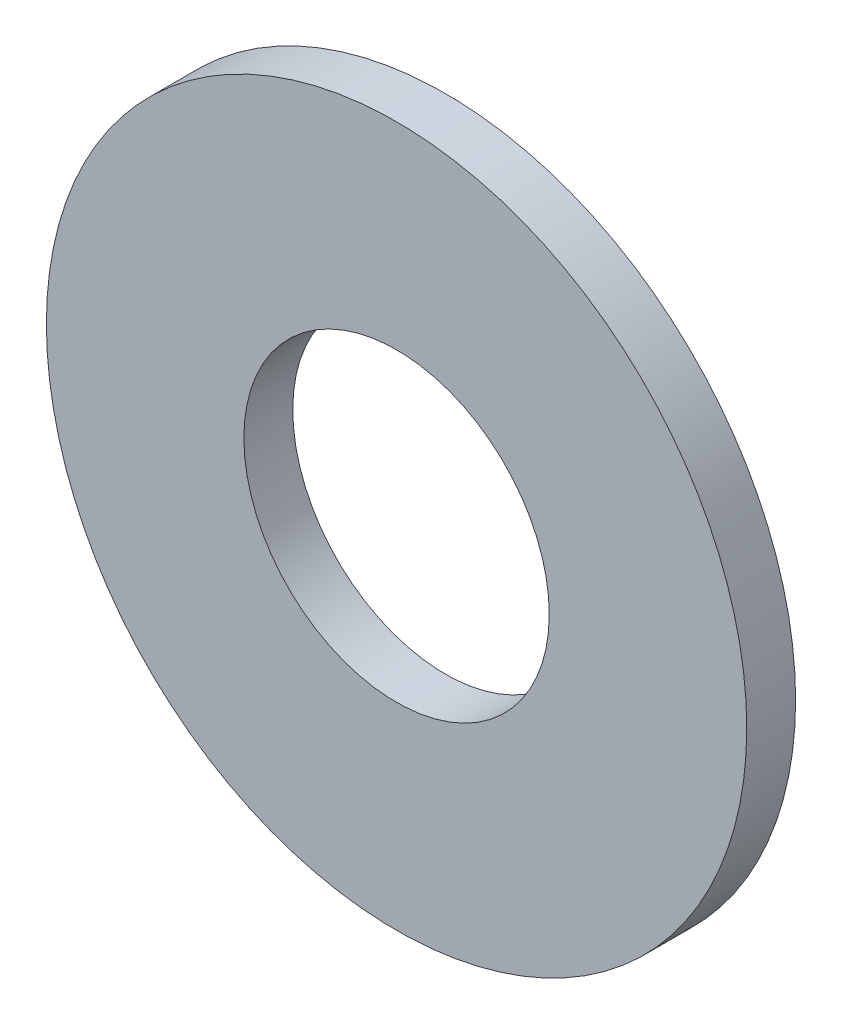
ISO-10303-21;
HEADER;
FILE_DESCRIPTION(('STEP AP214'),'2;1');
FILE_NAME('part.step','',(''),(''),'','','');
FILE_SCHEMA(('AUTOMOTIVE_DESIGN { 1 0 10303 214 1 1 1 1 }'));
ENDSEC;
DATA;
#1=APPLICATION_CONTEXT('core data for automotive mechanical design processes');
#2=APPLICATION_PROTOCOL_DEFINITION('international standard','automotive_design',2000,#1);
#3=PRODUCT_CONTEXT('',#1,'mechanical');
#4=PRODUCT('Part','Part','',(#3));
#5=PRODUCT_RELATED_PRODUCT_CATEGORY('part','',(#4));
#6=PRODUCT_DEFINITION_FORMATION('','',#4);
#7=PRODUCT_DEFINITION_CONTEXT('part definition',#1,'design');
#8=PRODUCT_DEFINITION('design','',#6,#7);
#9=PRODUCT_DEFINITION_SHAPE('','',#8);
#10=(LENGTH_UNIT() NAMED_UNIT(*) SI_UNIT(.MILLI.,.METRE.));
#11=(NAMED_UNIT(*) PLANE_ANGLE_UNIT() SI_UNIT($,.RADIAN.));
#12=(NAMED_UNIT(*) SI_UNIT($,.STERADIAN.) SOLID_ANGLE_UNIT());
#13=UNCERTAINTY_MEASURE_WITH_UNIT(LENGTH_MEASURE(1.E-05),#10,'distance_accuracy_value','');
#14=(GEOMETRIC_REPRESENTATION_CONTEXT(3) GLOBAL_UNCERTAINTY_ASSIGNED_CONTEXT((#13)) GLOBAL_UNIT_ASSIGNED_CONTEXT((#10,
#11,#12)) REPRESENTATION_CONTEXT('',''));
#15=CARTESIAN_POINT('',(0.,0.,0.));
#16=DIRECTION('',(0.,0.,1.));
#17=DIRECTION('',(1.,0.,0.));
#18=AXIS2_PLACEMENT_3D('',#15,#16,#17);
#19=CARTESIAN_POINT('',(0.,0.,12.));
#20=DIRECTION('',(0.,0.,1.));
#21=DIRECTION('',(1.,0.,0.));
#22=AXIS2_PLACEMENT_3D('',#19,#20,#21);
#23=PLANE('',#22);
#24=CARTESIAN_POINT('',(0.,0.,12.));
#25=DIRECTION('',(0.,0.,1.));
#26=DIRECTION('',(1.,0.,0.));
#27=AXIS2_PLACEMENT_3D('',#24,#25,#26);
#28=CIRCLE('',#27,86.);
#29=CARTESIAN_POINT('',(86.,0.,12.));
#30=VERTEX_POINT('',#29);
#31=EDGE_CURVE('E10',#30,#30,#28,.T.);
#32=ORIENTED_EDGE('',*,*,#31,.T.);
#33=EDGE_LOOP('',(#32));
#34=FACE_BOUND('',#33,.T.);
#35=CARTESIAN_POINT('',(0.,0.,12.));
#36=DIRECTION('',(0.,0.,1.));
#37=DIRECTION('',(1.,0.,0.));
#38=AXIS2_PLACEMENT_3D('',#35,#36,#37);
#39=CIRCLE('',#38,37.5);
#40=CARTESIAN_POINT('',(37.5,0.,12.));
#41=VERTEX_POINT('',#40);
#42=EDGE_CURVE('E43',#41,#41,#39,.T.);
#43=ORIENTED_EDGE('',*,*,#42,.F.);
#44=EDGE_LOOP('',(#43));
#45=FACE_BOUND('',#44,.T.);
#46=ADVANCED_FACE('F32',(#34,#45),#23,.T.);
#47=CARTESIAN_POINT('',(0.,0.,0.));
#48=DIRECTION('',(0.,0.,1.));
#49=DIRECTION('',(1.,0.,0.));
#50=AXIS2_PLACEMENT_3D('',#47,#48,#49);
#51=PLANE('',#50);
#52=CARTESIAN_POINT('',(0.,0.,0.));
#53=DIRECTION('',(0.,0.,1.));
#54=DIRECTION('',(1.,0.,0.));
#55=AXIS2_PLACEMENT_3D('',#52,#53,#54);
#56=CIRCLE('',#55,86.);
#57=CARTESIAN_POINT('',(86.,0.,0.));
#58=VERTEX_POINT('',#57);
#59=EDGE_CURVE('E36',#58,#58,#56,.T.);
#60=ORIENTED_EDGE('',*,*,#59,.F.);
#61=EDGE_LOOP('',(#60));
#62=FACE_BOUND('',#61,.T.);
#63=CARTESIAN_POINT('',(0.,0.,0.));
#64=DIRECTION('',(0.,0.,1.));
#65=DIRECTION('',(1.,0.,0.));
#66=AXIS2_PLACEMENT_3D('',#63,#64,#65);
#67=CIRCLE('',#66,37.5);
#68=CARTESIAN_POINT('',(37.5,0.,0.));
#69=VERTEX_POINT('',#68);
#70=EDGE_CURVE('E45',#69,#69,#67,.T.);
#71=ORIENTED_EDGE('',*,*,#70,.T.);
#72=EDGE_LOOP('',(#71));
#73=FACE_BOUND('',#72,.T.);
#74=ADVANCED_FACE('F55',(#62,#73),#51,.F.);
#75=CARTESIAN_POINT('',(0.,0.,12.));
#76=DIRECTION('',(0.,0.,-1.));
#77=DIRECTION('',(-1.,0.,0.));
#78=AXIS2_PLACEMENT_3D('',#75,#76,#77);
#79=CYLINDRICAL_SURFACE('',#78,86.);
#80=ORIENTED_EDGE('',*,*,#31,.F.);
#81=EDGE_LOOP('',(#80));
#82=FACE_BOUND('',#81,.T.);
#83=ORIENTED_EDGE('',*,*,#59,.T.);
#84=EDGE_LOOP('',(#83));
#85=FACE_BOUND('',#84,.T.);
#86=ADVANCED_FACE('F34',(#82,#85),#79,.T.);
#87=CARTESIAN_POINT('',(0.,0.,12.));
#88=DIRECTION('',(0.,0.,-1.));
#89=DIRECTION('',(-1.,0.,0.));
#90=AXIS2_PLACEMENT_3D('',#87,#88,#89);
#91=CYLINDRICAL_SURFACE('',#90,37.5);
#92=ORIENTED_EDGE('',*,*,#42,.T.);
#93=EDGE_LOOP('',(#92));
#94=FACE_BOUND('',#93,.T.);
#95=ORIENTED_EDGE('',*,*,#70,.F.);
#96=EDGE_LOOP('',(#95));
#97=FACE_BOUND('',#96,.T.);
#98=ADVANCED_FACE('F51',(#94,#97),#91,.F.);
#99=CLOSED_SHELL('',(#46,#74,#86,#98));
#100=MANIFOLD_SOLID_BREP('B2',#99);
#101=ADVANCED_BREP_SHAPE_REPRESENTATION('',(#18,#100),#14);
#102=SHAPE_DEFINITION_REPRESENTATION(#9,#101);
ENDSEC;
END-ISO-10303-21;
